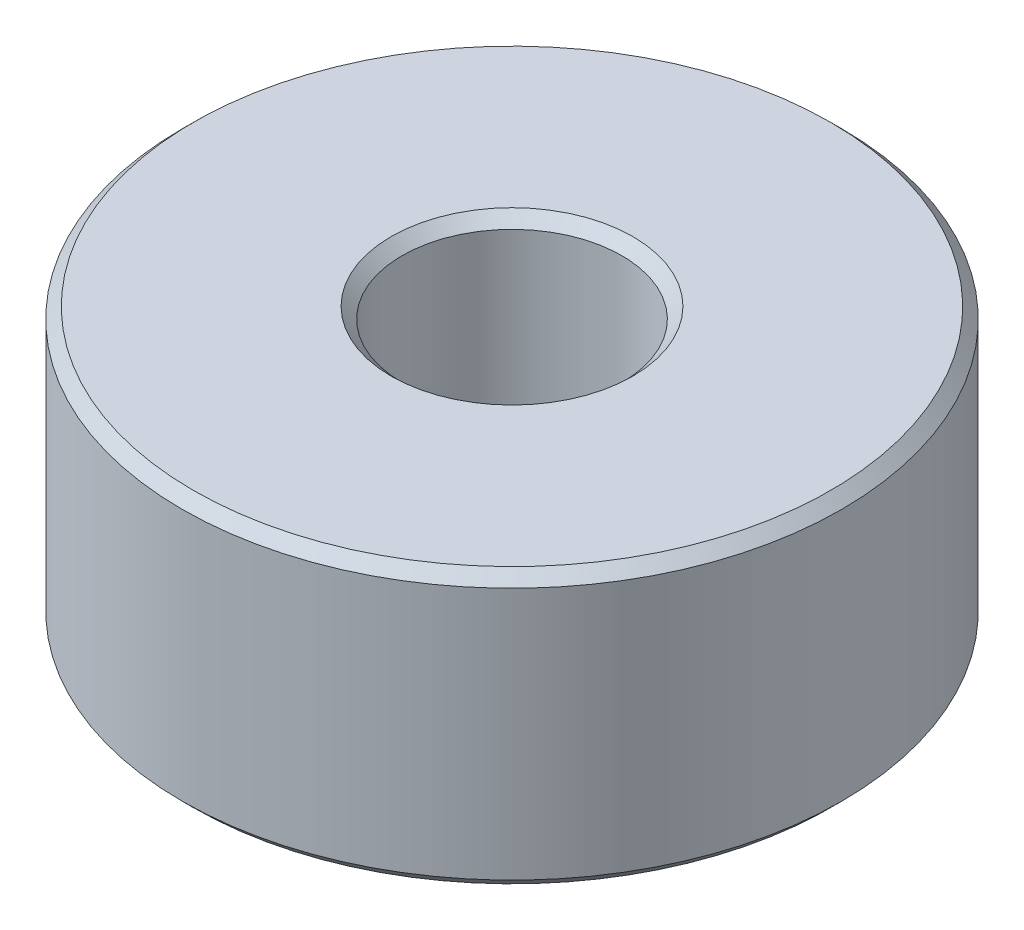
ISO-10303-21;
HEADER;
FILE_DESCRIPTION(('STEP AP214'),'2;1');
FILE_NAME('part.step','',(''),(''),'','','');
FILE_SCHEMA(('AUTOMOTIVE_DESIGN { 1 0 10303 214 1 1 1 1 }'));
ENDSEC;
DATA;
#1=APPLICATION_CONTEXT('core data for automotive mechanical design processes');
#2=APPLICATION_PROTOCOL_DEFINITION('international standard','automotive_design',2000,#1);
#3=PRODUCT_CONTEXT('',#1,'mechanical');
#4=PRODUCT('Part','Part','',(#3));
#5=PRODUCT_RELATED_PRODUCT_CATEGORY('part','',(#4));
#6=PRODUCT_DEFINITION_FORMATION('','',#4);
#7=PRODUCT_DEFINITION_CONTEXT('part definition',#1,'design');
#8=PRODUCT_DEFINITION('design','',#6,#7);
#9=PRODUCT_DEFINITION_SHAPE('','',#8);
#10=(LENGTH_UNIT() NAMED_UNIT(*) SI_UNIT(.MILLI.,.METRE.));
#11=(NAMED_UNIT(*) PLANE_ANGLE_UNIT() SI_UNIT($,.RADIAN.));
#12=(NAMED_UNIT(*) SI_UNIT($,.STERADIAN.) SOLID_ANGLE_UNIT());
#13=UNCERTAINTY_MEASURE_WITH_UNIT(LENGTH_MEASURE(1.E-05),#10,'distance_accuracy_value','');
#14=(GEOMETRIC_REPRESENTATION_CONTEXT(3) GLOBAL_UNCERTAINTY_ASSIGNED_CONTEXT((#13)) GLOBAL_UNIT_ASSIGNED_CONTEXT((#10,
#11,#12)) REPRESENTATION_CONTEXT('',''));
#15=CARTESIAN_POINT('',(0.,0.,0.));
#16=DIRECTION('',(0.,0.,1.));
#17=DIRECTION('',(1.,0.,0.));
#18=AXIS2_PLACEMENT_3D('',#15,#16,#17);
#19=CARTESIAN_POINT('',(0.,2.5,0.));
#20=DIRECTION('',(0.,1.,0.));
#21=DIRECTION('',(0.,0.,1.));
#22=AXIS2_PLACEMENT_3D('',#19,#20,#21);
#23=PLANE('',#22);
#24=CARTESIAN_POINT('',(0.,2.5,0.));
#25=DIRECTION('',(0.,1.,0.));
#26=DIRECTION('',(0.,0.,1.));
#27=AXIS2_PLACEMENT_3D('',#24,#25,#26);
#28=CIRCLE('',#27,1.1);
#29=CARTESIAN_POINT('',(0.,2.5,1.1));
#30=VERTEX_POINT('',#29);
#31=EDGE_CURVE('E10',#30,#30,#28,.F.);
#32=ORIENTED_EDGE('',*,*,#31,.T.);
#33=EDGE_LOOP('',(#32));
#34=FACE_BOUND('',#33,.T.);
#35=CARTESIAN_POINT('',(0.,2.5,0.));
#36=DIRECTION('',(0.,1.,0.));
#37=DIRECTION('',(0.,0.,1.));
#38=AXIS2_PLACEMENT_3D('',#35,#36,#37);
#39=CIRCLE('',#38,2.9);
#40=CARTESIAN_POINT('',(0.,2.5,2.9));
#41=VERTEX_POINT('',#40);
#42=EDGE_CURVE('E41',#41,#41,#39,.T.);
#43=ORIENTED_EDGE('',*,*,#42,.T.);
#44=EDGE_LOOP('',(#43));
#45=FACE_BOUND('',#44,.T.);
#46=ADVANCED_FACE('F33',(#34,#45),#23,.T.);
#47=CARTESIAN_POINT('',(0.,0.,0.));
#48=DIRECTION('',(0.,1.,0.));
#49=DIRECTION('',(0.,0.,1.));
#50=AXIS2_PLACEMENT_3D('',#47,#48,#49);
#51=PLANE('',#50);
#52=CARTESIAN_POINT('',(0.,0.,0.));
#53=DIRECTION('',(0.,1.,0.));
#54=DIRECTION('',(0.,0.,1.));
#55=AXIS2_PLACEMENT_3D('',#52,#53,#54);
#56=CIRCLE('',#55,1.1);
#57=CARTESIAN_POINT('',(0.,0.,1.1));
#58=VERTEX_POINT('',#57);
#59=EDGE_CURVE('E60',#58,#58,#56,.T.);
#60=ORIENTED_EDGE('',*,*,#59,.T.);
#61=EDGE_LOOP('',(#60));
#62=FACE_BOUND('',#61,.T.);
#63=CARTESIAN_POINT('',(0.,0.,0.));
#64=DIRECTION('',(0.,1.,0.));
#65=DIRECTION('',(0.,0.,1.));
#66=AXIS2_PLACEMENT_3D('',#63,#64,#65);
#67=CIRCLE('',#66,2.9);
#68=CARTESIAN_POINT('',(0.,0.,2.9));
#69=VERTEX_POINT('',#68);
#70=EDGE_CURVE('E63',#69,#69,#67,.F.);
#71=ORIENTED_EDGE('',*,*,#70,.T.);
#72=EDGE_LOOP('',(#71));
#73=FACE_BOUND('',#72,.T.);
#74=ADVANCED_FACE('F67',(#62,#73),#51,.F.);
#75=CARTESIAN_POINT('',(0.,2.5,0.));
#76=DIRECTION('',(0.,-1.,0.));
#77=DIRECTION('',(0.,0.,-1.));
#78=AXIS2_PLACEMENT_3D('',#75,#76,#77);
#79=CYLINDRICAL_SURFACE('',#78,3.);
#80=CARTESIAN_POINT('',(0.,0.0999999999999994,0.));
#81=DIRECTION('',(0.,1.,0.));
#82=DIRECTION('',(0.,0.,1.));
#83=AXIS2_PLACEMENT_3D('',#80,#81,#82);
#84=CIRCLE('',#83,3.);
#85=CARTESIAN_POINT('',(0.,0.0999999999999994,3.));
#86=VERTEX_POINT('',#85);
#87=EDGE_CURVE('E45',#86,#86,#84,.T.);
#88=ORIENTED_EDGE('',*,*,#87,.T.);
#89=EDGE_LOOP('',(#88));
#90=FACE_BOUND('',#89,.T.);
#91=CARTESIAN_POINT('',(0.,2.4,0.));
#92=DIRECTION('',(0.,1.,0.));
#93=DIRECTION('',(0.,0.,1.));
#94=AXIS2_PLACEMENT_3D('',#91,#92,#93);
#95=CIRCLE('',#94,3.);
#96=CARTESIAN_POINT('',(0.,2.4,3.));
#97=VERTEX_POINT('',#96);
#98=EDGE_CURVE('E49',#97,#97,#95,.F.);
#99=ORIENTED_EDGE('',*,*,#98,.T.);
#100=EDGE_LOOP('',(#99));
#101=FACE_BOUND('',#100,.T.);
#102=ADVANCED_FACE('F77',(#90,#101),#79,.T.);
#103=CARTESIAN_POINT('',(0.,2.5,0.));
#104=DIRECTION('',(0.,-1.,0.));
#105=DIRECTION('',(0.,0.,-1.));
#106=AXIS2_PLACEMENT_3D('',#103,#104,#105);
#107=CYLINDRICAL_SURFACE('',#106,1.);
#108=CARTESIAN_POINT('',(0.,0.1,0.));
#109=DIRECTION('',(0.,1.,0.));
#110=DIRECTION('',(0.,0.,1.));
#111=AXIS2_PLACEMENT_3D('',#108,#109,#110);
#112=CIRCLE('',#111,1.);
#113=CARTESIAN_POINT('',(0.,0.1,1.));
#114=VERTEX_POINT('',#113);
#115=EDGE_CURVE('E54',#114,#114,#112,.F.);
#116=ORIENTED_EDGE('',*,*,#115,.T.);
#117=EDGE_LOOP('',(#116));
#118=FACE_BOUND('',#117,.T.);
#119=CARTESIAN_POINT('',(0.,2.4,0.));
#120=DIRECTION('',(0.,1.,0.));
#121=DIRECTION('',(0.,0.,1.));
#122=AXIS2_PLACEMENT_3D('',#119,#120,#121);
#123=CIRCLE('',#122,1.);
#124=CARTESIAN_POINT('',(0.,2.4,1.));
#125=VERTEX_POINT('',#124);
#126=EDGE_CURVE('E57',#125,#125,#123,.T.);
#127=ORIENTED_EDGE('',*,*,#126,.T.);
#128=EDGE_LOOP('',(#127));
#129=FACE_BOUND('',#128,.T.);
#130=ADVANCED_FACE('F80',(#118,#129),#107,.F.);
#131=CARTESIAN_POINT('',(0.,0.,0.));
#132=DIRECTION('',(0.,-1.,0.));
#133=DIRECTION('',(0.,0.,-1.));
#134=AXIS2_PLACEMENT_3D('',#131,#132,#133);
#135=CONICAL_SURFACE('',#134,1.1,0.785398163397448);
#136=ORIENTED_EDGE('',*,*,#115,.F.);
#137=EDGE_LOOP('',(#136));
#138=FACE_BOUND('',#137,.T.);
#139=ORIENTED_EDGE('',*,*,#59,.F.);
#140=EDGE_LOOP('',(#139));
#141=FACE_BOUND('',#140,.T.);
#142=ADVANCED_FACE('F73',(#138,#141),#135,.F.);
#143=CARTESIAN_POINT('',(0.,0.0999999999999994,0.));
#144=DIRECTION('',(0.,1.,0.));
#145=DIRECTION('',(0.,0.,1.));
#146=AXIS2_PLACEMENT_3D('',#143,#144,#145);
#147=CONICAL_SURFACE('',#146,3.,0.78539816339745);
#148=ORIENTED_EDGE('',*,*,#70,.F.);
#149=EDGE_LOOP('',(#148));
#150=FACE_BOUND('',#149,.T.);
#151=ORIENTED_EDGE('',*,*,#87,.F.);
#152=EDGE_LOOP('',(#151));
#153=FACE_BOUND('',#152,.T.);
#154=ADVANCED_FACE('F69',(#150,#153),#147,.T.);
#155=CARTESIAN_POINT('',(0.,2.4,0.));
#156=DIRECTION('',(0.,1.,0.));
#157=DIRECTION('',(0.,0.,1.));
#158=AXIS2_PLACEMENT_3D('',#155,#156,#157);
#159=CONICAL_SURFACE('',#158,1.,0.785398163397453);
#160=ORIENTED_EDGE('',*,*,#31,.F.);
#161=EDGE_LOOP('',(#160));
#162=FACE_BOUND('',#161,.T.);
#163=ORIENTED_EDGE('',*,*,#126,.F.);
#164=EDGE_LOOP('',(#163));
#165=FACE_BOUND('',#164,.T.);
#166=ADVANCED_FACE('F72',(#162,#165),#159,.F.);
#167=CARTESIAN_POINT('',(0.,2.5,0.));
#168=DIRECTION('',(0.,-1.,0.));
#169=DIRECTION('',(0.,0.,-1.));
#170=AXIS2_PLACEMENT_3D('',#167,#168,#169);
#171=CONICAL_SURFACE('',#170,2.9,0.785398163397446);
#172=ORIENTED_EDGE('',*,*,#98,.F.);
#173=EDGE_LOOP('',(#172));
#174=FACE_BOUND('',#173,.T.);
#175=ORIENTED_EDGE('',*,*,#42,.F.);
#176=EDGE_LOOP('',(#175));
#177=FACE_BOUND('',#176,.T.);
#178=ADVANCED_FACE('F36',(#174,#177),#171,.T.);
#179=CLOSED_SHELL('',(#46,#74,#102,#130,#142,#154,#166,#178));
#180=MANIFOLD_SOLID_BREP('B2',#179);
#181=ADVANCED_BREP_SHAPE_REPRESENTATION('',(#18,#180),#14);
#182=SHAPE_DEFINITION_REPRESENTATION(#9,#181);
ENDSEC;
END-ISO-10303-21;
